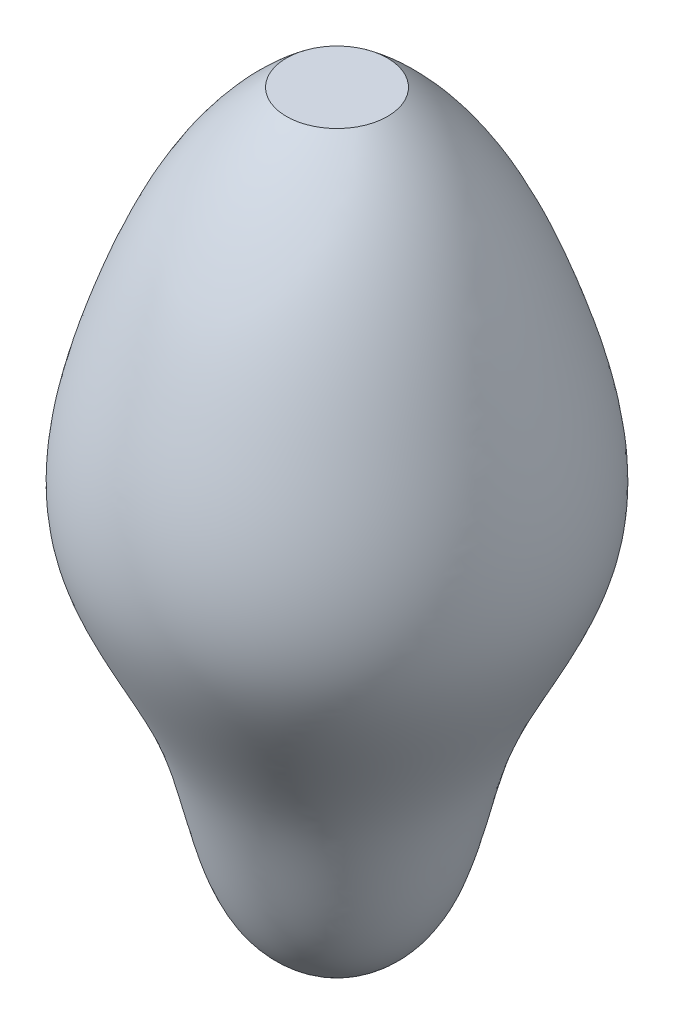
ISO-10303-21;
HEADER;
FILE_DESCRIPTION(('STEP AP214'),'2;1');
FILE_NAME('part.step','',(''),(''),'','','');
FILE_SCHEMA(('AUTOMOTIVE_DESIGN { 1 0 10303 214 1 1 1 1 }'));
ENDSEC;
DATA;
#1=APPLICATION_CONTEXT('core data for automotive mechanical design processes');
#2=APPLICATION_PROTOCOL_DEFINITION('international standard','automotive_design',2000,#1);
#3=PRODUCT_CONTEXT('',#1,'mechanical');
#4=PRODUCT('Part','Part','',(#3));
#5=PRODUCT_RELATED_PRODUCT_CATEGORY('part','',(#4));
#6=PRODUCT_DEFINITION_FORMATION('','',#4);
#7=PRODUCT_DEFINITION_CONTEXT('part definition',#1,'design');
#8=PRODUCT_DEFINITION('design','',#6,#7);
#9=PRODUCT_DEFINITION_SHAPE('','',#8);
#10=(LENGTH_UNIT() NAMED_UNIT(*) SI_UNIT(.MILLI.,.METRE.));
#11=(NAMED_UNIT(*) PLANE_ANGLE_UNIT() SI_UNIT($,.RADIAN.));
#12=(NAMED_UNIT(*) SI_UNIT($,.STERADIAN.) SOLID_ANGLE_UNIT());
#13=UNCERTAINTY_MEASURE_WITH_UNIT(LENGTH_MEASURE(1.E-05),#10,'distance_accuracy_value','');
#14=(GEOMETRIC_REPRESENTATION_CONTEXT(3) GLOBAL_UNCERTAINTY_ASSIGNED_CONTEXT((#13)) GLOBAL_UNIT_ASSIGNED_CONTEXT((#10,
#11,#12)) REPRESENTATION_CONTEXT('',''));
#15=CARTESIAN_POINT('',(0.,0.,0.));
#16=DIRECTION('',(0.,0.,1.));
#17=DIRECTION('',(1.,0.,0.));
#18=AXIS2_PLACEMENT_3D('',#15,#16,#17);
#19=CARTESIAN_POINT('',(0.,0.,0.));
#20=CARTESIAN_POINT('',(40.5078591941608,9.40584580851882,0.));
#21=CARTESIAN_POINT('',(37.0248406460058,77.0594099494092,0.));
#22=CARTESIAN_POINT('',(90.9853069909149,145.770300315616,0.));
#23=CARTESIAN_POINT('',(69.3766261027433,230.001602705309,0.));
#24=CARTESIAN_POINT('',(45.8676777703005,279.872491051289,0.));
#25=CARTESIAN_POINT('',(20.,300.,0.));
#26=B_SPLINE_CURVE_WITH_KNOTS('',3,(#19,#20,#21,#22,#23,#24,#25),.UNSPECIFIED.,.F.,.F.,(4,1,1,1,
4),(0.,0.290748642202246,0.513734736912114,0.720772128241759,1.),.UNSPECIFIED.);
#27=CARTESIAN_POINT('',(0.,0.,0.));
#28=DIRECTION('',(0.,-1.,0.));
#29=AXIS1_PLACEMENT('',#27,#28);
#30=SURFACE_OF_REVOLUTION('',#26,#29);
#31=CARTESIAN_POINT('',(0.,300.,0.));
#32=DIRECTION('',(0.,-1.,0.));
#33=DIRECTION('',(0.,0.,-1.));
#34=AXIS2_PLACEMENT_3D('',#31,#32,#33);
#35=CIRCLE('',#34,20.);
#36=CARTESIAN_POINT('',(0.,300.,-20.));
#37=VERTEX_POINT('',#36);
#38=EDGE_CURVE('E11',#37,#37,#35,.T.);
#39=ORIENTED_EDGE('',*,*,#38,.T.);
#40=EDGE_LOOP('',(#39));
#41=FACE_BOUND('',#40,.T.);
#42=CARTESIAN_POINT('',(0.,0.,0.));
#43=VERTEX_POINT('',#42);
#44=VERTEX_LOOP('',#43);
#45=FACE_BOUND('',#44,.T.);
#46=ADVANCED_FACE('F41',(#41,#45),#30,.F.);
#47=CARTESIAN_POINT('',(20.,300.,0.));
#48=DIRECTION('',(0.,1.,0.));
#49=DIRECTION('',(0.,0.,1.));
#50=AXIS2_PLACEMENT_3D('',#47,#48,#49);
#51=PLANE('',#50);
#52=ORIENTED_EDGE('',*,*,#38,.F.);
#53=EDGE_LOOP('',(#52));
#54=FACE_BOUND('',#53,.T.);
#55=ADVANCED_FACE('F50',(#54),#51,.T.);
#56=CLOSED_SHELL('',(#46,#55));
#57=MANIFOLD_SOLID_BREP('B2',#56);
#58=ADVANCED_BREP_SHAPE_REPRESENTATION('',(#18,#57),#14);
#59=SHAPE_DEFINITION_REPRESENTATION(#9,#58);
ENDSEC;
END-ISO-10303-21;
